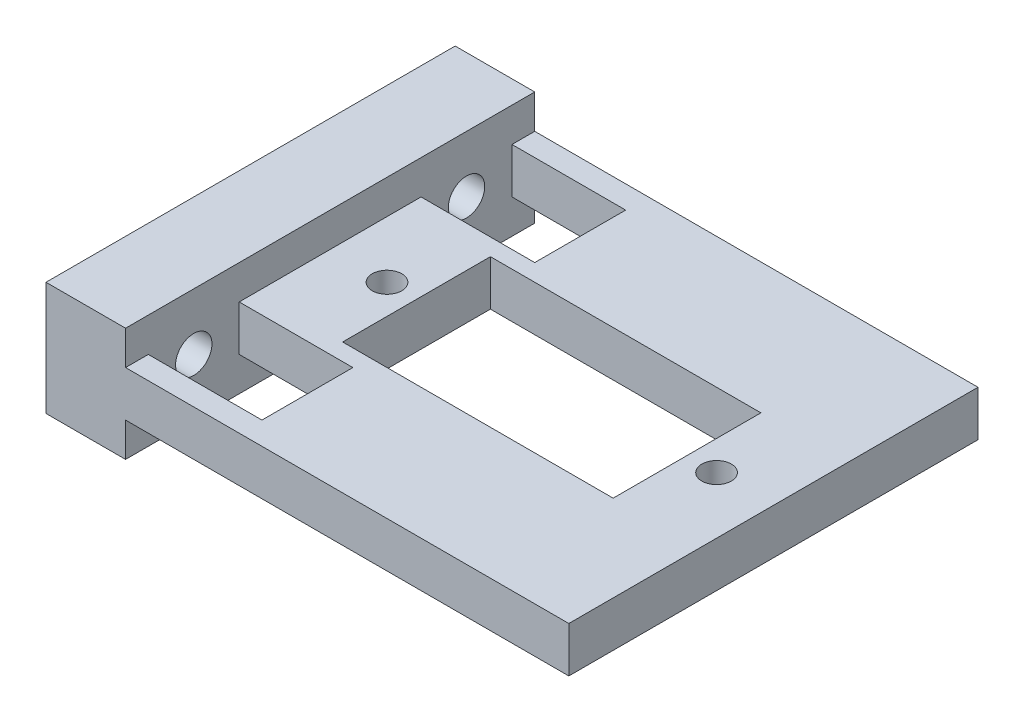
ISO-10303-21;
HEADER;
FILE_DESCRIPTION(('STEP AP214'),'2;1');
FILE_NAME('part.step','',(''),(''),'','','');
FILE_SCHEMA(('AUTOMOTIVE_DESIGN { 1 0 10303 214 1 1 1 1 }'));
ENDSEC;
DATA;
#1=APPLICATION_CONTEXT('core data for automotive mechanical design processes');
#2=APPLICATION_PROTOCOL_DEFINITION('international standard','automotive_design',2000,#1);
#3=PRODUCT_CONTEXT('',#1,'mechanical');
#4=PRODUCT('Part','Part','',(#3));
#5=PRODUCT_RELATED_PRODUCT_CATEGORY('part','',(#4));
#6=PRODUCT_DEFINITION_FORMATION('','',#4);
#7=PRODUCT_DEFINITION_CONTEXT('part definition',#1,'design');
#8=PRODUCT_DEFINITION('design','',#6,#7);
#9=PRODUCT_DEFINITION_SHAPE('','',#8);
#10=(LENGTH_UNIT() NAMED_UNIT(*) SI_UNIT(.MILLI.,.METRE.));
#11=(NAMED_UNIT(*) PLANE_ANGLE_UNIT() SI_UNIT($,.RADIAN.));
#12=(NAMED_UNIT(*) SI_UNIT($,.STERADIAN.) SOLID_ANGLE_UNIT());
#13=UNCERTAINTY_MEASURE_WITH_UNIT(LENGTH_MEASURE(1.E-05),#10,'distance_accuracy_value','');
#14=(GEOMETRIC_REPRESENTATION_CONTEXT(3) GLOBAL_UNCERTAINTY_ASSIGNED_CONTEXT((#13)) GLOBAL_UNIT_ASSIGNED_CONTEXT((#10,
#11,#12)) REPRESENTATION_CONTEXT('',''));
#15=CARTESIAN_POINT('',(0.,0.,0.));
#16=DIRECTION('',(0.,0.,1.));
#17=DIRECTION('',(1.,0.,0.));
#18=AXIS2_PLACEMENT_3D('',#15,#16,#17);
#19=CARTESIAN_POINT('',(0.,30.,0.));
#20=DIRECTION('',(0.,-1.,0.));
#21=DIRECTION('',(0.,0.,-1.));
#22=AXIS2_PLACEMENT_3D('',#19,#20,#21);
#23=PLANE('',#22);
#24=CARTESIAN_POINT('',(-9.,30.,0.));
#25=DIRECTION('',(0.,-1.,0.));
#26=DIRECTION('',(0.,0.,-1.));
#27=AXIS2_PLACEMENT_3D('',#24,#25,#26);
#28=CIRCLE('',#27,1.3);
#29=CARTESIAN_POINT('',(-9.,30.,-1.3));
#30=VERTEX_POINT('',#29);
#31=EDGE_CURVE('E252',#30,#30,#28,.F.);
#32=ORIENTED_EDGE('',*,*,#31,.F.);
#33=EDGE_LOOP('',(#32));
#34=FACE_BOUND('',#33,.T.);
#35=CARTESIAN_POINT('',(20.,30.,0.));
#36=DIRECTION('',(0.,-1.,0.));
#37=DIRECTION('',(0.,0.,-1.));
#38=AXIS2_PLACEMENT_3D('',#35,#36,#37);
#39=CIRCLE('',#38,1.3);
#40=CARTESIAN_POINT('',(20.,30.,-1.3));
#41=VERTEX_POINT('',#40);
#42=EDGE_CURVE('E250',#41,#41,#39,.F.);
#43=ORIENTED_EDGE('',*,*,#42,.F.);
#44=EDGE_LOOP('',(#43));
#45=FACE_BOUND('',#44,.T.);
#46=DIRECTION('',(0.,0.,1.));
#47=VECTOR('',#46,1.);
#48=CARTESIAN_POINT('',(-6.4,30.,0.));
#49=LINE('',#48,#47);
#50=CARTESIAN_POINT('',(-6.4,30.,-6.5));
#51=VERTEX_POINT('',#50);
#52=CARTESIAN_POINT('',(-6.4,30.,6.5));
#53=VERTEX_POINT('',#52);
#54=EDGE_CURVE('E299',#51,#53,#49,.T.);
#55=ORIENTED_EDGE('',*,*,#54,.F.);
#56=DIRECTION('',(-1.,0.,0.));
#57=VECTOR('',#56,1.);
#58=CARTESIAN_POINT('',(0.,30.,-6.5));
#59=LINE('',#58,#57);
#60=CARTESIAN_POINT('',(17.4,30.,-6.5));
#61=VERTEX_POINT('',#60);
#62=EDGE_CURVE('E292',#61,#51,#59,.T.);
#63=ORIENTED_EDGE('',*,*,#62,.F.);
#64=DIRECTION('',(0.,0.,-1.));
#65=VECTOR('',#64,1.);
#66=CARTESIAN_POINT('',(17.4,30.,0.));
#67=LINE('',#66,#65);
#68=CARTESIAN_POINT('',(17.4,30.,6.5));
#69=VERTEX_POINT('',#68);
#70=EDGE_CURVE('E295',#69,#61,#67,.T.);
#71=ORIENTED_EDGE('',*,*,#70,.F.);
#72=DIRECTION('',(1.,0.,0.));
#73=VECTOR('',#72,1.);
#74=CARTESIAN_POINT('',(0.,30.,6.5));
#75=LINE('',#74,#73);
#76=EDGE_CURVE('E300',#53,#69,#75,.T.);
#77=ORIENTED_EDGE('',*,*,#76,.F.);
#78=EDGE_LOOP('',(#55,#63,#71,#77));
#79=FACE_BOUND('',#78,.T.);
#80=DIRECTION('',(1.,0.,0.));
#81=VECTOR('',#80,1.);
#82=CARTESIAN_POINT('',(0.,30.,16.));
#83=LINE('',#82,#81);
#84=CARTESIAN_POINT('',(-14.,30.,16.));
#85=VERTEX_POINT('',#84);
#86=CARTESIAN_POINT('',(-4.,30.,16.));
#87=VERTEX_POINT('',#86);
#88=EDGE_CURVE('E358',#85,#87,#83,.T.);
#89=ORIENTED_EDGE('',*,*,#88,.F.);
#90=DIRECTION('',(0.,0.,-1.));
#91=VECTOR('',#90,1.);
#92=CARTESIAN_POINT('',(-14.,30.,0.));
#93=LINE('',#92,#91);
#94=CARTESIAN_POINT('',(-14.,30.,18.));
#95=VERTEX_POINT('',#94);
#96=EDGE_CURVE('E194',#95,#85,#93,.T.);
#97=ORIENTED_EDGE('',*,*,#96,.F.);
#98=DIRECTION('',(1.,0.,0.));
#99=VECTOR('',#98,1.);
#100=CARTESIAN_POINT('',(-21.,30.,18.));
#101=LINE('',#100,#99);
#102=CARTESIAN_POINT('',(25.,30.,18.));
#103=VERTEX_POINT('',#102);
#104=EDGE_CURVE('E202',#95,#103,#101,.T.);
#105=ORIENTED_EDGE('',*,*,#104,.T.);
#106=DIRECTION('',(0.,0.,-1.));
#107=VECTOR('',#106,1.);
#108=CARTESIAN_POINT('',(25.,30.,18.));
#109=LINE('',#108,#107);
#110=CARTESIAN_POINT('',(25.,30.,-18.));
#111=VERTEX_POINT('',#110);
#112=EDGE_CURVE('E207',#103,#111,#109,.T.);
#113=ORIENTED_EDGE('',*,*,#112,.T.);
#114=DIRECTION('',(-1.,0.,0.));
#115=VECTOR('',#114,1.);
#116=CARTESIAN_POINT('',(-21.,30.,-18.));
#117=LINE('',#116,#115);
#118=CARTESIAN_POINT('',(-14.,30.,-18.));
#119=VERTEX_POINT('',#118);
#120=EDGE_CURVE('E209',#111,#119,#117,.T.);
#121=ORIENTED_EDGE('',*,*,#120,.T.);
#122=CARTESIAN_POINT('',(-14.,30.,-16.));
#123=VERTEX_POINT('',#122);
#124=EDGE_CURVE('E198',#123,#119,#93,.T.);
#125=ORIENTED_EDGE('',*,*,#124,.F.);
#126=DIRECTION('',(-1.,0.,0.));
#127=VECTOR('',#126,1.);
#128=CARTESIAN_POINT('',(0.,30.,-16.));
#129=LINE('',#128,#127);
#130=CARTESIAN_POINT('',(-4.,30.,-16.));
#131=VERTEX_POINT('',#130);
#132=EDGE_CURVE('E266',#131,#123,#129,.T.);
#133=ORIENTED_EDGE('',*,*,#132,.F.);
#134=DIRECTION('',(0.,0.,-1.));
#135=VECTOR('',#134,1.);
#136=CARTESIAN_POINT('',(-4.,30.,0.));
#137=LINE('',#136,#135);
#138=CARTESIAN_POINT('',(-4.,30.,-8.));
#139=VERTEX_POINT('',#138);
#140=EDGE_CURVE('E268',#139,#131,#137,.T.);
#141=ORIENTED_EDGE('',*,*,#140,.F.);
#142=DIRECTION('',(1.,0.,0.));
#143=VECTOR('',#142,1.);
#144=CARTESIAN_POINT('',(0.,30.,-8.));
#145=LINE('',#144,#143);
#146=CARTESIAN_POINT('',(-14.,30.,-8.));
#147=VERTEX_POINT('',#146);
#148=EDGE_CURVE('E193',#147,#139,#145,.T.);
#149=ORIENTED_EDGE('',*,*,#148,.F.);
#150=CARTESIAN_POINT('',(-14.,30.,8.));
#151=VERTEX_POINT('',#150);
#152=EDGE_CURVE('E187',#151,#147,#93,.T.);
#153=ORIENTED_EDGE('',*,*,#152,.F.);
#154=DIRECTION('',(-1.,0.,0.));
#155=VECTOR('',#154,1.);
#156=CARTESIAN_POINT('',(0.,30.,8.));
#157=LINE('',#156,#155);
#158=CARTESIAN_POINT('',(-4.,30.,8.));
#159=VERTEX_POINT('',#158);
#160=EDGE_CURVE('E173',#159,#151,#157,.T.);
#161=ORIENTED_EDGE('',*,*,#160,.F.);
#162=DIRECTION('',(0.,0.,-1.));
#163=VECTOR('',#162,1.);
#164=CARTESIAN_POINT('',(-4.,30.,0.));
#165=LINE('',#164,#163);
#166=EDGE_CURVE('E355',#87,#159,#165,.T.);
#167=ORIENTED_EDGE('',*,*,#166,.F.);
#168=EDGE_LOOP('',(#89,#97,#105,#113,#121,#125,#133,#141,#149,#153,#161,#167));
#169=FACE_BOUND('',#168,.T.);
#170=ADVANCED_FACE('F39',(#34,#45,#79,#169),#23,.F.);
#171=CARTESIAN_POINT('',(0.,26.,0.));
#172=DIRECTION('',(0.,-1.,0.));
#173=DIRECTION('',(0.,0.,-1.));
#174=AXIS2_PLACEMENT_3D('',#171,#172,#173);
#175=PLANE('',#174);
#176=CARTESIAN_POINT('',(-9.,26.,0.));
#177=DIRECTION('',(0.,-1.,0.));
#178=DIRECTION('',(0.,0.,-1.));
#179=AXIS2_PLACEMENT_3D('',#176,#177,#178);
#180=CIRCLE('',#179,1.3);
#181=CARTESIAN_POINT('',(-9.,26.,-1.3));
#182=VERTEX_POINT('',#181);
#183=EDGE_CURVE('E247',#182,#182,#180,.F.);
#184=ORIENTED_EDGE('',*,*,#183,.T.);
#185=EDGE_LOOP('',(#184));
#186=FACE_BOUND('',#185,.T.);
#187=CARTESIAN_POINT('',(20.,26.,0.));
#188=DIRECTION('',(0.,-1.,0.));
#189=DIRECTION('',(0.,0.,-1.));
#190=AXIS2_PLACEMENT_3D('',#187,#188,#189);
#191=CIRCLE('',#190,1.3);
#192=CARTESIAN_POINT('',(20.,26.,-1.3));
#193=VERTEX_POINT('',#192);
#194=EDGE_CURVE('E242',#193,#193,#191,.F.);
#195=ORIENTED_EDGE('',*,*,#194,.T.);
#196=EDGE_LOOP('',(#195));
#197=FACE_BOUND('',#196,.T.);
#198=DIRECTION('',(-1.,0.,0.));
#199=VECTOR('',#198,1.);
#200=CARTESIAN_POINT('',(0.,26.,-6.5));
#201=LINE('',#200,#199);
#202=CARTESIAN_POINT('',(17.4,26.,-6.5));
#203=VERTEX_POINT('',#202);
#204=CARTESIAN_POINT('',(-6.4,26.,-6.5));
#205=VERTEX_POINT('',#204);
#206=EDGE_CURVE('E233',#203,#205,#201,.T.);
#207=ORIENTED_EDGE('',*,*,#206,.T.);
#208=DIRECTION('',(0.,0.,1.));
#209=VECTOR('',#208,1.);
#210=CARTESIAN_POINT('',(-6.4,26.,0.));
#211=LINE('',#210,#209);
#212=CARTESIAN_POINT('',(-6.4,26.,6.5));
#213=VERTEX_POINT('',#212);
#214=EDGE_CURVE('E239',#205,#213,#211,.T.);
#215=ORIENTED_EDGE('',*,*,#214,.T.);
#216=DIRECTION('',(1.,0.,0.));
#217=VECTOR('',#216,1.);
#218=CARTESIAN_POINT('',(0.,26.,6.5));
#219=LINE('',#218,#217);
#220=CARTESIAN_POINT('',(17.4,26.,6.5));
#221=VERTEX_POINT('',#220);
#222=EDGE_CURVE('E240',#213,#221,#219,.T.);
#223=ORIENTED_EDGE('',*,*,#222,.T.);
#224=DIRECTION('',(0.,0.,-1.));
#225=VECTOR('',#224,1.);
#226=CARTESIAN_POINT('',(17.4,26.,0.));
#227=LINE('',#226,#225);
#228=EDGE_CURVE('E234',#221,#203,#227,.T.);
#229=ORIENTED_EDGE('',*,*,#228,.T.);
#230=EDGE_LOOP('',(#207,#215,#223,#229));
#231=FACE_BOUND('',#230,.T.);
#232=DIRECTION('',(0.,0.,-1.));
#233=VECTOR('',#232,1.);
#234=CARTESIAN_POINT('',(-14.,26.,0.));
#235=LINE('',#234,#233);
#236=CARTESIAN_POINT('',(-14.,26.,18.));
#237=VERTEX_POINT('',#236);
#238=CARTESIAN_POINT('',(-14.,26.,16.));
#239=VERTEX_POINT('',#238);
#240=EDGE_CURVE('E226',#237,#239,#235,.T.);
#241=ORIENTED_EDGE('',*,*,#240,.T.);
#242=DIRECTION('',(1.,0.,0.));
#243=VECTOR('',#242,1.);
#244=CARTESIAN_POINT('',(0.,26.,16.));
#245=LINE('',#244,#243);
#246=CARTESIAN_POINT('',(-4.,26.,16.));
#247=VERTEX_POINT('',#246);
#248=EDGE_CURVE('E178',#239,#247,#245,.T.);
#249=ORIENTED_EDGE('',*,*,#248,.T.);
#250=DIRECTION('',(0.,0.,-1.));
#251=VECTOR('',#250,1.);
#252=CARTESIAN_POINT('',(-4.,26.,0.));
#253=LINE('',#252,#251);
#254=CARTESIAN_POINT('',(-4.,26.,8.));
#255=VERTEX_POINT('',#254);
#256=EDGE_CURVE('E11',#247,#255,#253,.T.);
#257=ORIENTED_EDGE('',*,*,#256,.T.);
#258=DIRECTION('',(-1.,0.,0.));
#259=VECTOR('',#258,1.);
#260=CARTESIAN_POINT('',(0.,26.,8.));
#261=LINE('',#260,#259);
#262=CARTESIAN_POINT('',(-14.,26.,8.));
#263=VERTEX_POINT('',#262);
#264=EDGE_CURVE('E177',#255,#263,#261,.T.);
#265=ORIENTED_EDGE('',*,*,#264,.T.);
#266=CARTESIAN_POINT('',(-14.,26.,-8.));
#267=VERTEX_POINT('',#266);
#268=EDGE_CURVE('E189',#263,#267,#235,.T.);
#269=ORIENTED_EDGE('',*,*,#268,.T.);
#270=DIRECTION('',(1.,0.,0.));
#271=VECTOR('',#270,1.);
#272=CARTESIAN_POINT('',(0.,26.,-8.));
#273=LINE('',#272,#271);
#274=CARTESIAN_POINT('',(-4.,26.,-8.));
#275=VERTEX_POINT('',#274);
#276=EDGE_CURVE('E50',#267,#275,#273,.T.);
#277=ORIENTED_EDGE('',*,*,#276,.T.);
#278=DIRECTION('',(0.,0.,-1.));
#279=VECTOR('',#278,1.);
#280=CARTESIAN_POINT('',(-4.,26.,0.));
#281=LINE('',#280,#279);
#282=CARTESIAN_POINT('',(-4.,26.,-16.));
#283=VERTEX_POINT('',#282);
#284=EDGE_CURVE('E251',#275,#283,#281,.T.);
#285=ORIENTED_EDGE('',*,*,#284,.T.);
#286=DIRECTION('',(-1.,0.,0.));
#287=VECTOR('',#286,1.);
#288=CARTESIAN_POINT('',(0.,26.,-16.));
#289=LINE('',#288,#287);
#290=CARTESIAN_POINT('',(-14.,26.,-16.));
#291=VERTEX_POINT('',#290);
#292=EDGE_CURVE('E243',#283,#291,#289,.T.);
#293=ORIENTED_EDGE('',*,*,#292,.T.);
#294=CARTESIAN_POINT('',(-14.,26.,-18.));
#295=VERTEX_POINT('',#294);
#296=EDGE_CURVE('E227',#291,#295,#235,.T.);
#297=ORIENTED_EDGE('',*,*,#296,.T.);
#298=DIRECTION('',(-1.,0.,0.));
#299=VECTOR('',#298,1.);
#300=CARTESIAN_POINT('',(-21.,26.,-18.));
#301=LINE('',#300,#299);
#302=CARTESIAN_POINT('',(25.,26.,-18.));
#303=VERTEX_POINT('',#302);
#304=EDGE_CURVE('E210',#303,#295,#301,.T.);
#305=ORIENTED_EDGE('',*,*,#304,.F.);
#306=DIRECTION('',(0.,0.,-1.));
#307=VECTOR('',#306,1.);
#308=CARTESIAN_POINT('',(25.,26.,18.));
#309=LINE('',#308,#307);
#310=CARTESIAN_POINT('',(25.,26.,18.));
#311=VERTEX_POINT('',#310);
#312=EDGE_CURVE('E213',#311,#303,#309,.T.);
#313=ORIENTED_EDGE('',*,*,#312,.F.);
#314=DIRECTION('',(1.,0.,0.));
#315=VECTOR('',#314,1.);
#316=CARTESIAN_POINT('',(-21.,26.,18.));
#317=LINE('',#316,#315);
#318=EDGE_CURVE('E200',#237,#311,#317,.T.);
#319=ORIENTED_EDGE('',*,*,#318,.F.);
#320=EDGE_LOOP('',(#241,#249,#257,#265,#269,#277,#285,#293,#297,#305,#313,#319));
#321=FACE_BOUND('',#320,.T.);
#322=ADVANCED_FACE('F258',(#186,#197,#231,#321),#175,.T.);
#323=CARTESIAN_POINT('',(-21.,30.,18.));
#324=DIRECTION('',(1.,0.,0.));
#325=DIRECTION('',(0.,0.,-1.));
#326=AXIS2_PLACEMENT_3D('',#323,#324,#325);
#327=PLANE('',#326);
#328=CARTESIAN_POINT('',(-21.,28.,-12.));
#329=DIRECTION('',(1.,0.,0.));
#330=DIRECTION('',(0.,0.,-1.));
#331=AXIS2_PLACEMENT_3D('',#328,#329,#330);
#332=CIRCLE('',#331,1.6);
#333=CARTESIAN_POINT('',(-21.,28.,-13.6));
#334=VERTEX_POINT('',#333);
#335=EDGE_CURVE('E186',#334,#334,#332,.F.);
#336=ORIENTED_EDGE('',*,*,#335,.F.);
#337=EDGE_LOOP('',(#336));
#338=FACE_BOUND('',#337,.T.);
#339=CARTESIAN_POINT('',(-21.,28.,12.));
#340=DIRECTION('',(1.,0.,0.));
#341=DIRECTION('',(0.,0.,-1.));
#342=AXIS2_PLACEMENT_3D('',#339,#340,#341);
#343=CIRCLE('',#342,1.6);
#344=CARTESIAN_POINT('',(-21.,28.,10.4));
#345=VERTEX_POINT('',#344);
#346=EDGE_CURVE('E369',#345,#345,#343,.F.);
#347=ORIENTED_EDGE('',*,*,#346,.F.);
#348=EDGE_LOOP('',(#347));
#349=FACE_BOUND('',#348,.T.);
#350=DIRECTION('',(0.,-1.,0.));
#351=VECTOR('',#350,1.);
#352=CARTESIAN_POINT('',(-21.,30.,-18.));
#353=LINE('',#352,#351);
#354=CARTESIAN_POINT('',(-21.,33.,-18.));
#355=VERTEX_POINT('',#354);
#356=CARTESIAN_POINT('',(-21.,23.,-18.));
#357=VERTEX_POINT('',#356);
#358=EDGE_CURVE('E215',#355,#357,#353,.T.);
#359=ORIENTED_EDGE('',*,*,#358,.T.);
#360=DIRECTION('',(0.,0.,-1.));
#361=VECTOR('',#360,1.);
#362=CARTESIAN_POINT('',(-21.,23.,18.));
#363=LINE('',#362,#361);
#364=CARTESIAN_POINT('',(-21.,23.,18.));
#365=VERTEX_POINT('',#364);
#366=EDGE_CURVE('E196',#365,#357,#363,.T.);
#367=ORIENTED_EDGE('',*,*,#366,.F.);
#368=DIRECTION('',(0.,-1.,0.));
#369=VECTOR('',#368,1.);
#370=CARTESIAN_POINT('',(-21.,30.,18.));
#371=LINE('',#370,#369);
#372=CARTESIAN_POINT('',(-21.,33.,18.));
#373=VERTEX_POINT('',#372);
#374=EDGE_CURVE('E224',#373,#365,#371,.T.);
#375=ORIENTED_EDGE('',*,*,#374,.F.);
#376=DIRECTION('',(0.,0.,-1.));
#377=VECTOR('',#376,1.);
#378=CARTESIAN_POINT('',(-21.,33.,18.));
#379=LINE('',#378,#377);
#380=EDGE_CURVE('E315',#373,#355,#379,.T.);
#381=ORIENTED_EDGE('',*,*,#380,.T.);
#382=EDGE_LOOP('',(#359,#367,#375,#381));
#383=FACE_BOUND('',#382,.T.);
#384=ADVANCED_FACE('F41',(#338,#349,#383),#327,.F.);
#385=CARTESIAN_POINT('',(-21.,30.,18.));
#386=DIRECTION('',(0.,0.,-1.));
#387=DIRECTION('',(-1.,0.,0.));
#388=AXIS2_PLACEMENT_3D('',#385,#386,#387);
#389=PLANE('',#388);
#390=ORIENTED_EDGE('',*,*,#374,.T.);
#391=DIRECTION('',(1.,0.,0.));
#392=VECTOR('',#391,1.);
#393=CARTESIAN_POINT('',(-21.,23.,18.));
#394=LINE('',#393,#392);
#395=CARTESIAN_POINT('',(-14.,23.,18.));
#396=VERTEX_POINT('',#395);
#397=EDGE_CURVE('E305',#365,#396,#394,.T.);
#398=ORIENTED_EDGE('',*,*,#397,.T.);
#399=DIRECTION('',(0.,1.,0.));
#400=VECTOR('',#399,1.);
#401=CARTESIAN_POINT('',(-14.,23.,18.));
#402=LINE('',#401,#400);
#403=EDGE_CURVE('E306',#396,#237,#402,.T.);
#404=ORIENTED_EDGE('',*,*,#403,.T.);
#405=ORIENTED_EDGE('',*,*,#318,.T.);
#406=DIRECTION('',(0.,-1.,0.));
#407=VECTOR('',#406,1.);
#408=CARTESIAN_POINT('',(25.,30.,18.));
#409=LINE('',#408,#407);
#410=EDGE_CURVE('E225',#103,#311,#409,.T.);
#411=ORIENTED_EDGE('',*,*,#410,.F.);
#412=ORIENTED_EDGE('',*,*,#104,.F.);
#413=CARTESIAN_POINT('',(-14.,33.,18.));
#414=VERTEX_POINT('',#413);
#415=EDGE_CURVE('E302',#95,#414,#402,.T.);
#416=ORIENTED_EDGE('',*,*,#415,.T.);
#417=DIRECTION('',(-1.,0.,0.));
#418=VECTOR('',#417,1.);
#419=CARTESIAN_POINT('',(-21.,33.,18.));
#420=LINE('',#419,#418);
#421=EDGE_CURVE('E307',#414,#373,#420,.T.);
#422=ORIENTED_EDGE('',*,*,#421,.T.);
#423=EDGE_LOOP('',(#390,#398,#404,#405,#411,#412,#416,#422));
#424=FACE_BOUND('',#423,.T.);
#425=ADVANCED_FACE('F396',(#424),#389,.F.);
#426=CARTESIAN_POINT('',(25.,30.,18.));
#427=DIRECTION('',(-1.,0.,0.));
#428=DIRECTION('',(0.,0.,1.));
#429=AXIS2_PLACEMENT_3D('',#426,#427,#428);
#430=PLANE('',#429);
#431=ORIENTED_EDGE('',*,*,#312,.T.);
#432=DIRECTION('',(0.,-1.,0.));
#433=VECTOR('',#432,1.);
#434=CARTESIAN_POINT('',(25.,30.,-18.));
#435=LINE('',#434,#433);
#436=EDGE_CURVE('E220',#111,#303,#435,.T.);
#437=ORIENTED_EDGE('',*,*,#436,.F.);
#438=ORIENTED_EDGE('',*,*,#112,.F.);
#439=ORIENTED_EDGE('',*,*,#410,.T.);
#440=EDGE_LOOP('',(#431,#437,#438,#439));
#441=FACE_BOUND('',#440,.T.);
#442=ADVANCED_FACE('F405',(#441),#430,.F.);
#443=CARTESIAN_POINT('',(-21.,30.,-18.));
#444=DIRECTION('',(0.,0.,1.));
#445=DIRECTION('',(1.,0.,0.));
#446=AXIS2_PLACEMENT_3D('',#443,#444,#445);
#447=PLANE('',#446);
#448=ORIENTED_EDGE('',*,*,#304,.T.);
#449=DIRECTION('',(0.,1.,0.));
#450=VECTOR('',#449,1.);
#451=CARTESIAN_POINT('',(-14.,23.,-18.));
#452=LINE('',#451,#450);
#453=CARTESIAN_POINT('',(-14.,23.,-18.));
#454=VERTEX_POINT('',#453);
#455=EDGE_CURVE('E317',#454,#295,#452,.T.);
#456=ORIENTED_EDGE('',*,*,#455,.F.);
#457=DIRECTION('',(1.,0.,0.));
#458=VECTOR('',#457,1.);
#459=CARTESIAN_POINT('',(-21.,23.,-18.));
#460=LINE('',#459,#458);
#461=EDGE_CURVE('E301',#357,#454,#460,.T.);
#462=ORIENTED_EDGE('',*,*,#461,.F.);
#463=ORIENTED_EDGE('',*,*,#358,.F.);
#464=DIRECTION('',(-1.,0.,0.));
#465=VECTOR('',#464,1.);
#466=CARTESIAN_POINT('',(-21.,33.,-18.));
#467=LINE('',#466,#465);
#468=CARTESIAN_POINT('',(-14.,33.,-18.));
#469=VERTEX_POINT('',#468);
#470=EDGE_CURVE('E304',#469,#355,#467,.T.);
#471=ORIENTED_EDGE('',*,*,#470,.F.);
#472=EDGE_CURVE('E314',#119,#469,#452,.T.);
#473=ORIENTED_EDGE('',*,*,#472,.F.);
#474=ORIENTED_EDGE('',*,*,#120,.F.);
#475=ORIENTED_EDGE('',*,*,#436,.T.);
#476=EDGE_LOOP('',(#448,#456,#462,#463,#471,#473,#474,#475));
#477=FACE_BOUND('',#476,.T.);
#478=ADVANCED_FACE('F336',(#477),#447,.F.);
#479=CARTESIAN_POINT('',(-21.,23.,18.));
#480=DIRECTION('',(0.,1.,0.));
#481=DIRECTION('',(0.,0.,1.));
#482=AXIS2_PLACEMENT_3D('',#479,#480,#481);
#483=PLANE('',#482);
#484=ORIENTED_EDGE('',*,*,#461,.T.);
#485=DIRECTION('',(0.,0.,-1.));
#486=VECTOR('',#485,1.);
#487=CARTESIAN_POINT('',(-14.,23.,18.));
#488=LINE('',#487,#486);
#489=EDGE_CURVE('E323',#396,#454,#488,.T.);
#490=ORIENTED_EDGE('',*,*,#489,.F.);
#491=ORIENTED_EDGE('',*,*,#397,.F.);
#492=ORIENTED_EDGE('',*,*,#366,.T.);
#493=EDGE_LOOP('',(#484,#490,#491,#492));
#494=FACE_BOUND('',#493,.T.);
#495=ADVANCED_FACE('F331',(#494),#483,.F.);
#496=CARTESIAN_POINT('',(-14.,23.,18.));
#497=DIRECTION('',(-1.,0.,0.));
#498=DIRECTION('',(0.,0.,1.));
#499=AXIS2_PLACEMENT_3D('',#496,#497,#498);
#500=PLANE('',#499);
#501=CARTESIAN_POINT('',(-14.,28.,-12.));
#502=DIRECTION('',(1.,0.,0.));
#503=DIRECTION('',(0.,0.,-1.));
#504=AXIS2_PLACEMENT_3D('',#501,#502,#503);
#505=CIRCLE('',#504,1.6);
#506=CARTESIAN_POINT('',(-14.,28.,-13.6));
#507=VERTEX_POINT('',#506);
#508=EDGE_CURVE('E373',#507,#507,#505,.T.);
#509=ORIENTED_EDGE('',*,*,#508,.F.);
#510=EDGE_LOOP('',(#509));
#511=FACE_BOUND('',#510,.T.);
#512=CARTESIAN_POINT('',(-14.,28.,12.));
#513=DIRECTION('',(1.,0.,0.));
#514=DIRECTION('',(0.,0.,-1.));
#515=AXIS2_PLACEMENT_3D('',#512,#513,#514);
#516=CIRCLE('',#515,1.6);
#517=CARTESIAN_POINT('',(-14.,28.,10.4));
#518=VERTEX_POINT('',#517);
#519=EDGE_CURVE('E372',#518,#518,#516,.T.);
#520=ORIENTED_EDGE('',*,*,#519,.F.);
#521=EDGE_LOOP('',(#520));
#522=FACE_BOUND('',#521,.T.);
#523=DIRECTION('',(0.,-1.,0.));
#524=VECTOR('',#523,1.);
#525=CARTESIAN_POINT('',(-14.,33.,8.));
#526=LINE('',#525,#524);
#527=EDGE_CURVE('E56',#151,#263,#526,.T.);
#528=ORIENTED_EDGE('',*,*,#527,.F.);
#529=ORIENTED_EDGE('',*,*,#152,.T.);
#530=DIRECTION('',(0.,-1.,0.));
#531=VECTOR('',#530,1.);
#532=CARTESIAN_POINT('',(-14.,33.,-8.));
#533=LINE('',#532,#531);
#534=EDGE_CURVE('E262',#147,#267,#533,.T.);
#535=ORIENTED_EDGE('',*,*,#534,.T.);
#536=ORIENTED_EDGE('',*,*,#268,.F.);
#537=EDGE_LOOP('',(#528,#529,#535,#536));
#538=FACE_BOUND('',#537,.T.);
#539=ORIENTED_EDGE('',*,*,#472,.T.);
#540=DIRECTION('',(0.,0.,-1.));
#541=VECTOR('',#540,1.);
#542=CARTESIAN_POINT('',(-14.,33.,18.));
#543=LINE('',#542,#541);
#544=EDGE_CURVE('E322',#414,#469,#543,.T.);
#545=ORIENTED_EDGE('',*,*,#544,.F.);
#546=ORIENTED_EDGE('',*,*,#415,.F.);
#547=ORIENTED_EDGE('',*,*,#96,.T.);
#548=DIRECTION('',(0.,-1.,0.));
#549=VECTOR('',#548,1.);
#550=CARTESIAN_POINT('',(-14.,33.,16.));
#551=LINE('',#550,#549);
#552=EDGE_CURVE('E363',#85,#239,#551,.T.);
#553=ORIENTED_EDGE('',*,*,#552,.T.);
#554=ORIENTED_EDGE('',*,*,#240,.F.);
#555=ORIENTED_EDGE('',*,*,#403,.F.);
#556=ORIENTED_EDGE('',*,*,#489,.T.);
#557=ORIENTED_EDGE('',*,*,#455,.T.);
#558=ORIENTED_EDGE('',*,*,#296,.F.);
#559=DIRECTION('',(0.,-1.,0.));
#560=VECTOR('',#559,1.);
#561=CARTESIAN_POINT('',(-14.,33.,-16.));
#562=LINE('',#561,#560);
#563=EDGE_CURVE('E342',#123,#291,#562,.T.);
#564=ORIENTED_EDGE('',*,*,#563,.F.);
#565=ORIENTED_EDGE('',*,*,#124,.T.);
#566=EDGE_LOOP('',(#539,#545,#546,#547,#553,#554,#555,#556,#557,#558,#564,#565));
#567=FACE_BOUND('',#566,.T.);
#568=ADVANCED_FACE('F182',(#511,#522,#538,#567),#500,.F.);
#569=CARTESIAN_POINT('',(-21.,33.,18.));
#570=DIRECTION('',(0.,-1.,0.));
#571=DIRECTION('',(0.,0.,-1.));
#572=AXIS2_PLACEMENT_3D('',#569,#570,#571);
#573=PLANE('',#572);
#574=ORIENTED_EDGE('',*,*,#470,.T.);
#575=ORIENTED_EDGE('',*,*,#380,.F.);
#576=ORIENTED_EDGE('',*,*,#421,.F.);
#577=ORIENTED_EDGE('',*,*,#544,.T.);
#578=EDGE_LOOP('',(#574,#575,#576,#577));
#579=FACE_BOUND('',#578,.T.);
#580=ADVANCED_FACE('F383',(#579),#573,.F.);
#581=CARTESIAN_POINT('',(-6.4,33.,6.5));
#582=DIRECTION('',(1.,0.,0.));
#583=DIRECTION('',(0.,0.,-1.));
#584=AXIS2_PLACEMENT_3D('',#581,#582,#583);
#585=PLANE('',#584);
#586=ORIENTED_EDGE('',*,*,#54,.T.);
#587=DIRECTION('',(0.,-1.,0.));
#588=VECTOR('',#587,1.);
#589=CARTESIAN_POINT('',(-6.4,33.,6.5));
#590=LINE('',#589,#588);
#591=EDGE_CURVE('E287',#53,#213,#590,.T.);
#592=ORIENTED_EDGE('',*,*,#591,.T.);
#593=ORIENTED_EDGE('',*,*,#214,.F.);
#594=DIRECTION('',(0.,-1.,0.));
#595=VECTOR('',#594,1.);
#596=CARTESIAN_POINT('',(-6.4,33.,-6.5));
#597=LINE('',#596,#595);
#598=EDGE_CURVE('E283',#51,#205,#597,.T.);
#599=ORIENTED_EDGE('',*,*,#598,.F.);
#600=EDGE_LOOP('',(#586,#592,#593,#599));
#601=FACE_BOUND('',#600,.T.);
#602=ADVANCED_FACE('F468',(#601),#585,.T.);
#603=CARTESIAN_POINT('',(-6.4,33.,6.5));
#604=DIRECTION('',(0.,0.,-1.));
#605=DIRECTION('',(-1.,0.,0.));
#606=AXIS2_PLACEMENT_3D('',#603,#604,#605);
#607=PLANE('',#606);
#608=ORIENTED_EDGE('',*,*,#76,.T.);
#609=DIRECTION('',(0.,-1.,0.));
#610=VECTOR('',#609,1.);
#611=CARTESIAN_POINT('',(17.4,33.,6.5));
#612=LINE('',#611,#610);
#613=EDGE_CURVE('E286',#69,#221,#612,.T.);
#614=ORIENTED_EDGE('',*,*,#613,.T.);
#615=ORIENTED_EDGE('',*,*,#222,.F.);
#616=ORIENTED_EDGE('',*,*,#591,.F.);
#617=EDGE_LOOP('',(#608,#614,#615,#616));
#618=FACE_BOUND('',#617,.T.);
#619=ADVANCED_FACE('F467',(#618),#607,.T.);
#620=CARTESIAN_POINT('',(17.4,33.,6.5));
#621=DIRECTION('',(-1.,0.,0.));
#622=DIRECTION('',(0.,0.,1.));
#623=AXIS2_PLACEMENT_3D('',#620,#621,#622);
#624=PLANE('',#623);
#625=ORIENTED_EDGE('',*,*,#70,.T.);
#626=DIRECTION('',(0.,-1.,0.));
#627=VECTOR('',#626,1.);
#628=CARTESIAN_POINT('',(17.4,33.,-6.5));
#629=LINE('',#628,#627);
#630=EDGE_CURVE('E282',#61,#203,#629,.T.);
#631=ORIENTED_EDGE('',*,*,#630,.T.);
#632=ORIENTED_EDGE('',*,*,#228,.F.);
#633=ORIENTED_EDGE('',*,*,#613,.F.);
#634=EDGE_LOOP('',(#625,#631,#632,#633));
#635=FACE_BOUND('',#634,.T.);
#636=ADVANCED_FACE('F465',(#635),#624,.T.);
#637=CARTESIAN_POINT('',(-6.4,33.,-6.5));
#638=DIRECTION('',(0.,0.,1.));
#639=DIRECTION('',(1.,0.,0.));
#640=AXIS2_PLACEMENT_3D('',#637,#638,#639);
#641=PLANE('',#640);
#642=ORIENTED_EDGE('',*,*,#62,.T.);
#643=ORIENTED_EDGE('',*,*,#598,.T.);
#644=ORIENTED_EDGE('',*,*,#206,.F.);
#645=ORIENTED_EDGE('',*,*,#630,.F.);
#646=EDGE_LOOP('',(#642,#643,#644,#645));
#647=FACE_BOUND('',#646,.T.);
#648=ADVANCED_FACE('F457',(#647),#641,.T.);
#649=CARTESIAN_POINT('',(20.,33.,0.));
#650=DIRECTION('',(0.,-1.,0.));
#651=DIRECTION('',(0.,0.,-1.));
#652=AXIS2_PLACEMENT_3D('',#649,#650,#651);
#653=CYLINDRICAL_SURFACE('',#652,1.3);
#654=ORIENTED_EDGE('',*,*,#194,.F.);
#655=EDGE_LOOP('',(#654));
#656=FACE_BOUND('',#655,.T.);
#657=ORIENTED_EDGE('',*,*,#42,.T.);
#658=EDGE_LOOP('',(#657));
#659=FACE_BOUND('',#658,.T.);
#660=ADVANCED_FACE('F453',(#656,#659),#653,.F.);
#661=CARTESIAN_POINT('',(-9.,33.,0.));
#662=DIRECTION('',(0.,-1.,0.));
#663=DIRECTION('',(0.,0.,-1.));
#664=AXIS2_PLACEMENT_3D('',#661,#662,#663);
#665=CYLINDRICAL_SURFACE('',#664,1.3);
#666=ORIENTED_EDGE('',*,*,#183,.F.);
#667=EDGE_LOOP('',(#666));
#668=FACE_BOUND('',#667,.T.);
#669=ORIENTED_EDGE('',*,*,#31,.T.);
#670=EDGE_LOOP('',(#669));
#671=FACE_BOUND('',#670,.T.);
#672=ADVANCED_FACE('F451',(#668,#671),#665,.F.);
#673=CARTESIAN_POINT('',(-14.,33.,-8.));
#674=DIRECTION('',(0.,0.,-1.));
#675=DIRECTION('',(-1.,0.,0.));
#676=AXIS2_PLACEMENT_3D('',#673,#674,#675);
#677=PLANE('',#676);
#678=ORIENTED_EDGE('',*,*,#148,.T.);
#679=DIRECTION('',(0.,-1.,0.));
#680=VECTOR('',#679,1.);
#681=CARTESIAN_POINT('',(-4.,33.,-8.));
#682=LINE('',#681,#680);
#683=EDGE_CURVE('E261',#139,#275,#682,.T.);
#684=ORIENTED_EDGE('',*,*,#683,.T.);
#685=ORIENTED_EDGE('',*,*,#276,.F.);
#686=ORIENTED_EDGE('',*,*,#534,.F.);
#687=EDGE_LOOP('',(#678,#684,#685,#686));
#688=FACE_BOUND('',#687,.T.);
#689=ADVANCED_FACE('F264',(#688),#677,.T.);
#690=CARTESIAN_POINT('',(-4.,33.,-8.));
#691=DIRECTION('',(-1.,0.,0.));
#692=DIRECTION('',(0.,0.,1.));
#693=AXIS2_PLACEMENT_3D('',#690,#691,#692);
#694=PLANE('',#693);
#695=ORIENTED_EDGE('',*,*,#140,.T.);
#696=DIRECTION('',(0.,-1.,0.));
#697=VECTOR('',#696,1.);
#698=CARTESIAN_POINT('',(-4.,33.,-16.));
#699=LINE('',#698,#697);
#700=EDGE_CURVE('E269',#131,#283,#699,.T.);
#701=ORIENTED_EDGE('',*,*,#700,.T.);
#702=ORIENTED_EDGE('',*,*,#284,.F.);
#703=ORIENTED_EDGE('',*,*,#683,.F.);
#704=EDGE_LOOP('',(#695,#701,#702,#703));
#705=FACE_BOUND('',#704,.T.);
#706=ADVANCED_FACE('F346',(#705),#694,.T.);
#707=CARTESIAN_POINT('',(-14.,33.,-16.));
#708=DIRECTION('',(0.,0.,1.));
#709=DIRECTION('',(1.,0.,0.));
#710=AXIS2_PLACEMENT_3D('',#707,#708,#709);
#711=PLANE('',#710);
#712=ORIENTED_EDGE('',*,*,#132,.T.);
#713=ORIENTED_EDGE('',*,*,#563,.T.);
#714=ORIENTED_EDGE('',*,*,#292,.F.);
#715=ORIENTED_EDGE('',*,*,#700,.F.);
#716=EDGE_LOOP('',(#712,#713,#714,#715));
#717=FACE_BOUND('',#716,.T.);
#718=ADVANCED_FACE('F347',(#717),#711,.T.);
#719=CARTESIAN_POINT('',(-4.,33.,16.));
#720=DIRECTION('',(-1.,0.,0.));
#721=DIRECTION('',(0.,0.,1.));
#722=AXIS2_PLACEMENT_3D('',#719,#720,#721);
#723=PLANE('',#722);
#724=ORIENTED_EDGE('',*,*,#166,.T.);
#725=DIRECTION('',(0.,-1.,0.));
#726=VECTOR('',#725,1.);
#727=CARTESIAN_POINT('',(-4.,33.,8.));
#728=LINE('',#727,#726);
#729=EDGE_CURVE('E53',#159,#255,#728,.T.);
#730=ORIENTED_EDGE('',*,*,#729,.T.);
#731=ORIENTED_EDGE('',*,*,#256,.F.);
#732=DIRECTION('',(0.,-1.,0.));
#733=VECTOR('',#732,1.);
#734=CARTESIAN_POINT('',(-4.,33.,16.));
#735=LINE('',#734,#733);
#736=EDGE_CURVE('E364',#87,#247,#735,.T.);
#737=ORIENTED_EDGE('',*,*,#736,.F.);
#738=EDGE_LOOP('',(#724,#730,#731,#737));
#739=FACE_BOUND('',#738,.T.);
#740=ADVANCED_FACE('F436',(#739),#723,.T.);
#741=CARTESIAN_POINT('',(-14.,33.,16.));
#742=DIRECTION('',(0.,0.,-1.));
#743=DIRECTION('',(-1.,0.,0.));
#744=AXIS2_PLACEMENT_3D('',#741,#742,#743);
#745=PLANE('',#744);
#746=ORIENTED_EDGE('',*,*,#88,.T.);
#747=ORIENTED_EDGE('',*,*,#736,.T.);
#748=ORIENTED_EDGE('',*,*,#248,.F.);
#749=ORIENTED_EDGE('',*,*,#552,.F.);
#750=EDGE_LOOP('',(#746,#747,#748,#749));
#751=FACE_BOUND('',#750,.T.);
#752=ADVANCED_FACE('F433',(#751),#745,.T.);
#753=CARTESIAN_POINT('',(-14.,33.,8.));
#754=DIRECTION('',(0.,0.,1.));
#755=DIRECTION('',(1.,0.,0.));
#756=AXIS2_PLACEMENT_3D('',#753,#754,#755);
#757=PLANE('',#756);
#758=ORIENTED_EDGE('',*,*,#160,.T.);
#759=ORIENTED_EDGE('',*,*,#527,.T.);
#760=ORIENTED_EDGE('',*,*,#264,.F.);
#761=ORIENTED_EDGE('',*,*,#729,.F.);
#762=EDGE_LOOP('',(#758,#759,#760,#761));
#763=FACE_BOUND('',#762,.T.);
#764=ADVANCED_FACE('F172',(#763),#757,.T.);
#765=CARTESIAN_POINT('',(-14.,28.,12.));
#766=DIRECTION('',(-1.,0.,0.));
#767=DIRECTION('',(0.,0.,1.));
#768=AXIS2_PLACEMENT_3D('',#765,#766,#767);
#769=CYLINDRICAL_SURFACE('',#768,1.6);
#770=ORIENTED_EDGE('',*,*,#519,.T.);
#771=EDGE_LOOP('',(#770));
#772=FACE_BOUND('',#771,.T.);
#773=ORIENTED_EDGE('',*,*,#346,.T.);
#774=EDGE_LOOP('',(#773));
#775=FACE_BOUND('',#774,.T.);
#776=ADVANCED_FACE('F388',(#772,#775),#769,.F.);
#777=CARTESIAN_POINT('',(-14.,28.,-12.));
#778=DIRECTION('',(-1.,0.,0.));
#779=DIRECTION('',(0.,0.,1.));
#780=AXIS2_PLACEMENT_3D('',#777,#778,#779);
#781=CYLINDRICAL_SURFACE('',#780,1.6);
#782=ORIENTED_EDGE('',*,*,#508,.T.);
#783=EDGE_LOOP('',(#782));
#784=FACE_BOUND('',#783,.T.);
#785=ORIENTED_EDGE('',*,*,#335,.T.);
#786=EDGE_LOOP('',(#785));
#787=FACE_BOUND('',#786,.T.);
#788=ADVANCED_FACE('F379',(#784,#787),#781,.F.);
#789=CLOSED_SHELL('',(#170,#322,#384,#425,#442,#478,#495,#568,#580,#602,#619,#636,#648,#660,
#672,#689,#706,#718,#740,#752,#764,#776,#788));
#790=MANIFOLD_SOLID_BREP('B2',#789);
#791=ADVANCED_BREP_SHAPE_REPRESENTATION('',(#18,#790),#14);
#792=SHAPE_DEFINITION_REPRESENTATION(#9,#791);
ENDSEC;
END-ISO-10303-21;
